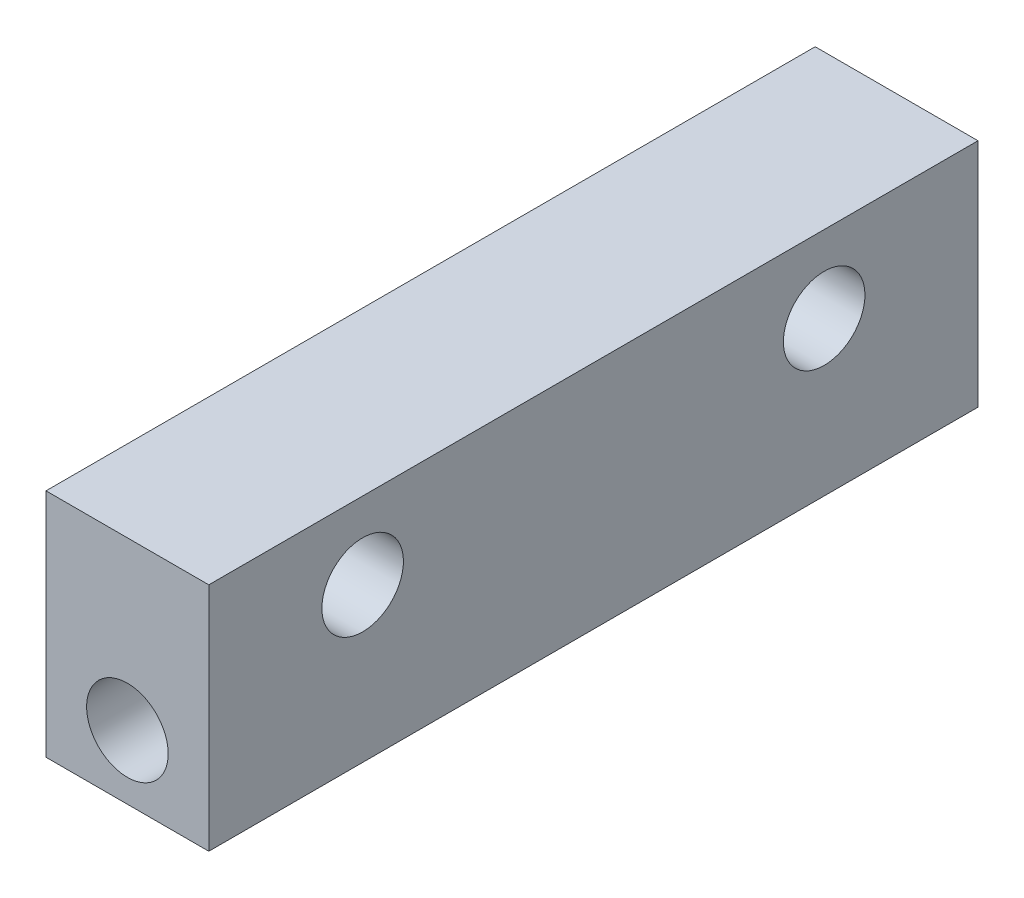
ISO-10303-21;
HEADER;
FILE_DESCRIPTION(('STEP AP214'),'2;1');
FILE_NAME('part.step','',(''),(''),'','','');
FILE_SCHEMA(('AUTOMOTIVE_DESIGN { 1 0 10303 214 1 1 1 1 }'));
ENDSEC;
DATA;
#1=APPLICATION_CONTEXT('core data for automotive mechanical design processes');
#2=APPLICATION_PROTOCOL_DEFINITION('international standard','automotive_design',2000,#1);
#3=PRODUCT_CONTEXT('',#1,'mechanical');
#4=PRODUCT('Part','Part','',(#3));
#5=PRODUCT_RELATED_PRODUCT_CATEGORY('part','',(#4));
#6=PRODUCT_DEFINITION_FORMATION('','',#4);
#7=PRODUCT_DEFINITION_CONTEXT('part definition',#1,'design');
#8=PRODUCT_DEFINITION('design','',#6,#7);
#9=PRODUCT_DEFINITION_SHAPE('','',#8);
#10=(LENGTH_UNIT() NAMED_UNIT(*) SI_UNIT(.MILLI.,.METRE.));
#11=(NAMED_UNIT(*) PLANE_ANGLE_UNIT() SI_UNIT($,.RADIAN.));
#12=(NAMED_UNIT(*) SI_UNIT($,.STERADIAN.) SOLID_ANGLE_UNIT());
#13=UNCERTAINTY_MEASURE_WITH_UNIT(LENGTH_MEASURE(1.E-05),#10,'distance_accuracy_value','');
#14=(GEOMETRIC_REPRESENTATION_CONTEXT(3) GLOBAL_UNCERTAINTY_ASSIGNED_CONTEXT((#13)) GLOBAL_UNIT_ASSIGNED_CONTEXT((#10,
#11,#12)) REPRESENTATION_CONTEXT('',''));
#15=CARTESIAN_POINT('',(0.,0.,0.));
#16=DIRECTION('',(0.,0.,1.));
#17=DIRECTION('',(1.,0.,0.));
#18=AXIS2_PLACEMENT_3D('',#15,#16,#17);
#19=CARTESIAN_POINT('',(0.,0.,30.));
#20=DIRECTION('',(0.,0.,1.));
#21=DIRECTION('',(1.,0.,0.));
#22=AXIS2_PLACEMENT_3D('',#19,#20,#21);
#23=PLANE('',#22);
#24=DIRECTION('',(0.,-1.,0.));
#25=VECTOR('',#24,1.);
#26=CARTESIAN_POINT('',(0.,0.,30.));
#27=LINE('',#26,#25);
#28=CARTESIAN_POINT('',(0.,0.,30.));
#29=VERTEX_POINT('',#28);
#30=CARTESIAN_POINT('',(0.,-9.,30.));
#31=VERTEX_POINT('',#30);
#32=EDGE_CURVE('E93',#29,#31,#27,.T.);
#33=ORIENTED_EDGE('',*,*,#32,.T.);
#34=DIRECTION('',(1.,0.,0.));
#35=VECTOR('',#34,1.);
#36=CARTESIAN_POINT('',(0.,-9.,30.));
#37=LINE('',#36,#35);
#38=CARTESIAN_POINT('',(6.35,-9.,30.));
#39=VERTEX_POINT('',#38);
#40=EDGE_CURVE('E88',#31,#39,#37,.T.);
#41=ORIENTED_EDGE('',*,*,#40,.T.);
#42=DIRECTION('',(0.,1.,0.));
#43=VECTOR('',#42,1.);
#44=CARTESIAN_POINT('',(6.35,0.,30.));
#45=LINE('',#44,#43);
#46=CARTESIAN_POINT('',(6.35,0.,30.));
#47=VERTEX_POINT('',#46);
#48=EDGE_CURVE('E91',#39,#47,#45,.T.);
#49=ORIENTED_EDGE('',*,*,#48,.T.);
#50=DIRECTION('',(-1.,0.,0.));
#51=VECTOR('',#50,1.);
#52=CARTESIAN_POINT('',(0.,0.,30.));
#53=LINE('',#52,#51);
#54=EDGE_CURVE('E58',#47,#29,#53,.T.);
#55=ORIENTED_EDGE('',*,*,#54,.T.);
#56=EDGE_LOOP('',(#33,#41,#49,#55));
#57=FACE_BOUND('',#56,.T.);
#58=CARTESIAN_POINT('',(3.175,-6.5,30.));
#59=DIRECTION('',(0.,0.,1.));
#60=DIRECTION('',(1.,0.,0.));
#61=AXIS2_PLACEMENT_3D('',#58,#59,#60);
#62=CIRCLE('',#61,1.591);
#63=CARTESIAN_POINT('',(4.766,-6.5,30.));
#64=VERTEX_POINT('',#63);
#65=EDGE_CURVE('E115',#64,#64,#62,.T.);
#66=ORIENTED_EDGE('',*,*,#65,.F.);
#67=EDGE_LOOP('',(#66));
#68=FACE_BOUND('',#67,.T.);
#69=ADVANCED_FACE('F38',(#57,#68),#23,.T.);
#70=CARTESIAN_POINT('',(0.,0.,0.));
#71=DIRECTION('',(0.,0.,1.));
#72=DIRECTION('',(1.,0.,0.));
#73=AXIS2_PLACEMENT_3D('',#70,#71,#72);
#74=PLANE('',#73);
#75=DIRECTION('',(0.,-1.,0.));
#76=VECTOR('',#75,1.);
#77=CARTESIAN_POINT('',(0.,0.,0.));
#78=LINE('',#77,#76);
#79=CARTESIAN_POINT('',(0.,0.,0.));
#80=VERTEX_POINT('',#79);
#81=CARTESIAN_POINT('',(0.,-9.,0.));
#82=VERTEX_POINT('',#81);
#83=EDGE_CURVE('E111',#80,#82,#78,.T.);
#84=ORIENTED_EDGE('',*,*,#83,.F.);
#85=DIRECTION('',(-1.,0.,0.));
#86=VECTOR('',#85,1.);
#87=CARTESIAN_POINT('',(0.,0.,0.));
#88=LINE('',#87,#86);
#89=CARTESIAN_POINT('',(6.35,0.,0.));
#90=VERTEX_POINT('',#89);
#91=EDGE_CURVE('E81',#90,#80,#88,.T.);
#92=ORIENTED_EDGE('',*,*,#91,.F.);
#93=DIRECTION('',(0.,1.,0.));
#94=VECTOR('',#93,1.);
#95=CARTESIAN_POINT('',(6.35,0.,0.));
#96=LINE('',#95,#94);
#97=CARTESIAN_POINT('',(6.35,-9.,0.));
#98=VERTEX_POINT('',#97);
#99=EDGE_CURVE('E75',#98,#90,#96,.T.);
#100=ORIENTED_EDGE('',*,*,#99,.F.);
#101=DIRECTION('',(1.,0.,0.));
#102=VECTOR('',#101,1.);
#103=CARTESIAN_POINT('',(0.,-9.,0.));
#104=LINE('',#103,#102);
#105=EDGE_CURVE('E98',#82,#98,#104,.T.);
#106=ORIENTED_EDGE('',*,*,#105,.F.);
#107=EDGE_LOOP('',(#84,#92,#100,#106));
#108=FACE_BOUND('',#107,.T.);
#109=CARTESIAN_POINT('',(3.175,-6.5,0.));
#110=DIRECTION('',(0.,0.,1.));
#111=DIRECTION('',(1.,0.,0.));
#112=AXIS2_PLACEMENT_3D('',#109,#110,#111);
#113=CIRCLE('',#112,1.591);
#114=CARTESIAN_POINT('',(4.766,-6.5,0.));
#115=VERTEX_POINT('',#114);
#116=EDGE_CURVE('E135',#115,#115,#113,.T.);
#117=ORIENTED_EDGE('',*,*,#116,.T.);
#118=EDGE_LOOP('',(#117));
#119=FACE_BOUND('',#118,.T.);
#120=ADVANCED_FACE('F163',(#108,#119),#74,.F.);
#121=CARTESIAN_POINT('',(0.,0.,30.));
#122=DIRECTION('',(1.,0.,0.));
#123=DIRECTION('',(0.,1.,0.));
#124=AXIS2_PLACEMENT_3D('',#121,#122,#123);
#125=PLANE('',#124);
#126=CARTESIAN_POINT('',(0.,-3.,24.));
#127=DIRECTION('',(1.,0.,0.));
#128=DIRECTION('',(0.,0.,-1.));
#129=AXIS2_PLACEMENT_3D('',#126,#127,#128);
#130=CIRCLE('',#129,1.59);
#131=CARTESIAN_POINT('',(0.,-3.,22.41));
#132=VERTEX_POINT('',#131);
#133=EDGE_CURVE('E128',#132,#132,#130,.T.);
#134=ORIENTED_EDGE('',*,*,#133,.T.);
#135=EDGE_LOOP('',(#134));
#136=FACE_BOUND('',#135,.T.);
#137=CARTESIAN_POINT('',(0.,-3.,6.));
#138=DIRECTION('',(1.,0.,0.));
#139=DIRECTION('',(0.,0.,-1.));
#140=AXIS2_PLACEMENT_3D('',#137,#138,#139);
#141=CIRCLE('',#140,1.59);
#142=CARTESIAN_POINT('',(0.,-3.,4.41));
#143=VERTEX_POINT('',#142);
#144=EDGE_CURVE('E137',#143,#143,#141,.T.);
#145=ORIENTED_EDGE('',*,*,#144,.T.);
#146=EDGE_LOOP('',(#145));
#147=FACE_BOUND('',#146,.T.);
#148=ORIENTED_EDGE('',*,*,#83,.T.);
#149=DIRECTION('',(0.,0.,-1.));
#150=VECTOR('',#149,1.);
#151=CARTESIAN_POINT('',(0.,-9.,30.));
#152=LINE('',#151,#150);
#153=EDGE_CURVE('E11',#31,#82,#152,.T.);
#154=ORIENTED_EDGE('',*,*,#153,.F.);
#155=ORIENTED_EDGE('',*,*,#32,.F.);
#156=DIRECTION('',(0.,0.,-1.));
#157=VECTOR('',#156,1.);
#158=CARTESIAN_POINT('',(0.,0.,30.));
#159=LINE('',#158,#157);
#160=EDGE_CURVE('E107',#29,#80,#159,.T.);
#161=ORIENTED_EDGE('',*,*,#160,.T.);
#162=EDGE_LOOP('',(#148,#154,#155,#161));
#163=FACE_BOUND('',#162,.T.);
#164=ADVANCED_FACE('F40',(#136,#147,#163),#125,.F.);
#165=CARTESIAN_POINT('',(0.,-9.,30.));
#166=DIRECTION('',(0.,1.,0.));
#167=DIRECTION('',(0.,0.,1.));
#168=AXIS2_PLACEMENT_3D('',#165,#166,#167);
#169=PLANE('',#168);
#170=ORIENTED_EDGE('',*,*,#105,.T.);
#171=DIRECTION('',(0.,0.,-1.));
#172=VECTOR('',#171,1.);
#173=CARTESIAN_POINT('',(6.35,-9.,30.));
#174=LINE('',#173,#172);
#175=EDGE_CURVE('E49',#39,#98,#174,.T.);
#176=ORIENTED_EDGE('',*,*,#175,.F.);
#177=ORIENTED_EDGE('',*,*,#40,.F.);
#178=ORIENTED_EDGE('',*,*,#153,.T.);
#179=EDGE_LOOP('',(#170,#176,#177,#178));
#180=FACE_BOUND('',#179,.T.);
#181=ADVANCED_FACE('F97',(#180),#169,.F.);
#182=CARTESIAN_POINT('',(6.35,0.,30.));
#183=DIRECTION('',(-1.,0.,0.));
#184=DIRECTION('',(0.,-1.,0.));
#185=AXIS2_PLACEMENT_3D('',#182,#183,#184);
#186=PLANE('',#185);
#187=CARTESIAN_POINT('',(6.35,-3.,24.));
#188=DIRECTION('',(-1.,0.,0.));
#189=DIRECTION('',(0.,-1.,0.));
#190=AXIS2_PLACEMENT_3D('',#187,#188,#189);
#191=CIRCLE('',#190,1.59);
#192=CARTESIAN_POINT('',(6.35,-4.59,24.));
#193=VERTEX_POINT('',#192);
#194=EDGE_CURVE('E42',#193,#193,#191,.F.);
#195=ORIENTED_EDGE('',*,*,#194,.F.);
#196=EDGE_LOOP('',(#195));
#197=FACE_BOUND('',#196,.T.);
#198=CARTESIAN_POINT('',(6.35,-3.,6.));
#199=DIRECTION('',(-1.,0.,0.));
#200=DIRECTION('',(0.,-1.,0.));
#201=AXIS2_PLACEMENT_3D('',#198,#199,#200);
#202=CIRCLE('',#201,1.59);
#203=CARTESIAN_POINT('',(6.35,-4.59,6.));
#204=VERTEX_POINT('',#203);
#205=EDGE_CURVE('E125',#204,#204,#202,.F.);
#206=ORIENTED_EDGE('',*,*,#205,.F.);
#207=EDGE_LOOP('',(#206));
#208=FACE_BOUND('',#207,.T.);
#209=ORIENTED_EDGE('',*,*,#99,.T.);
#210=DIRECTION('',(0.,0.,-1.));
#211=VECTOR('',#210,1.);
#212=CARTESIAN_POINT('',(6.35,0.,30.));
#213=LINE('',#212,#211);
#214=EDGE_CURVE('E100',#47,#90,#213,.T.);
#215=ORIENTED_EDGE('',*,*,#214,.F.);
#216=ORIENTED_EDGE('',*,*,#48,.F.);
#217=ORIENTED_EDGE('',*,*,#175,.T.);
#218=EDGE_LOOP('',(#209,#215,#216,#217));
#219=FACE_BOUND('',#218,.T.);
#220=ADVANCED_FACE('F102',(#197,#208,#219),#186,.F.);
#221=CARTESIAN_POINT('',(0.,0.,30.));
#222=DIRECTION('',(0.,-1.,0.));
#223=DIRECTION('',(0.,0.,-1.));
#224=AXIS2_PLACEMENT_3D('',#221,#222,#223);
#225=PLANE('',#224);
#226=ORIENTED_EDGE('',*,*,#91,.T.);
#227=ORIENTED_EDGE('',*,*,#160,.F.);
#228=ORIENTED_EDGE('',*,*,#54,.F.);
#229=ORIENTED_EDGE('',*,*,#214,.T.);
#230=EDGE_LOOP('',(#226,#227,#228,#229));
#231=FACE_BOUND('',#230,.T.);
#232=ADVANCED_FACE('F168',(#231),#225,.F.);
#233=CARTESIAN_POINT('',(3.175,-6.5,30.));
#234=DIRECTION('',(0.,0.,-1.));
#235=DIRECTION('',(-1.,0.,0.));
#236=AXIS2_PLACEMENT_3D('',#233,#234,#235);
#237=CYLINDRICAL_SURFACE('',#236,1.591);
#238=ORIENTED_EDGE('',*,*,#65,.T.);
#239=EDGE_LOOP('',(#238));
#240=FACE_BOUND('',#239,.T.);
#241=ORIENTED_EDGE('',*,*,#116,.F.);
#242=EDGE_LOOP('',(#241));
#243=FACE_BOUND('',#242,.T.);
#244=ADVANCED_FACE('F165',(#240,#243),#237,.F.);
#245=CARTESIAN_POINT('',(30.,-3.,6.));
#246=DIRECTION('',(-1.,0.,0.));
#247=DIRECTION('',(0.,0.,1.));
#248=AXIS2_PLACEMENT_3D('',#245,#246,#247);
#249=CYLINDRICAL_SURFACE('',#248,1.59);
#250=ORIENTED_EDGE('',*,*,#144,.F.);
#251=EDGE_LOOP('',(#250));
#252=FACE_BOUND('',#251,.T.);
#253=ORIENTED_EDGE('',*,*,#205,.T.);
#254=EDGE_LOOP('',(#253));
#255=FACE_BOUND('',#254,.T.);
#256=ADVANCED_FACE('F167',(#252,#255),#249,.F.);
#257=CARTESIAN_POINT('',(30.,-3.,24.));
#258=DIRECTION('',(-1.,0.,0.));
#259=DIRECTION('',(0.,0.,1.));
#260=AXIS2_PLACEMENT_3D('',#257,#258,#259);
#261=CYLINDRICAL_SURFACE('',#260,1.59);
#262=ORIENTED_EDGE('',*,*,#133,.F.);
#263=EDGE_LOOP('',(#262));
#264=FACE_BOUND('',#263,.T.);
#265=ORIENTED_EDGE('',*,*,#194,.T.);
#266=EDGE_LOOP('',(#265));
#267=FACE_BOUND('',#266,.T.);
#268=ADVANCED_FACE('F175',(#264,#267),#261,.F.);
#269=CLOSED_SHELL('',(#69,#120,#164,#181,#220,#232,#244,#256,#268));
#270=MANIFOLD_SOLID_BREP('B2',#269);
#271=ADVANCED_BREP_SHAPE_REPRESENTATION('',(#18,#270),#14);
#272=SHAPE_DEFINITION_REPRESENTATION(#9,#271);
ENDSEC;
END-ISO-10303-21;
